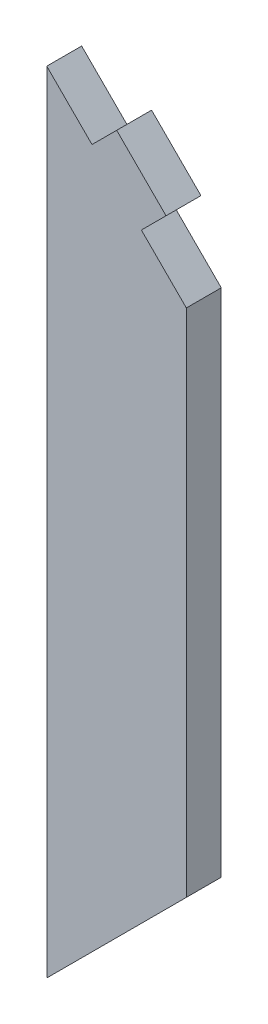
ISO-10303-21;
HEADER;
FILE_DESCRIPTION(('STEP AP214'),'2;1');
FILE_NAME('part.step','',(''),(''),'','','');
FILE_SCHEMA(('AUTOMOTIVE_DESIGN { 1 0 10303 214 1 1 1 1 }'));
ENDSEC;
DATA;
#1=APPLICATION_CONTEXT('core data for automotive mechanical design processes');
#2=APPLICATION_PROTOCOL_DEFINITION('international standard','automotive_design',2000,#1);
#3=PRODUCT_CONTEXT('',#1,'mechanical');
#4=PRODUCT('Part','Part','',(#3));
#5=PRODUCT_RELATED_PRODUCT_CATEGORY('part','',(#4));
#6=PRODUCT_DEFINITION_FORMATION('','',#4);
#7=PRODUCT_DEFINITION_CONTEXT('part definition',#1,'design');
#8=PRODUCT_DEFINITION('design','',#6,#7);
#9=PRODUCT_DEFINITION_SHAPE('','',#8);
#10=(LENGTH_UNIT() NAMED_UNIT(*) SI_UNIT(.MILLI.,.METRE.));
#11=(NAMED_UNIT(*) PLANE_ANGLE_UNIT() SI_UNIT($,.RADIAN.));
#12=(NAMED_UNIT(*) SI_UNIT($,.STERADIAN.) SOLID_ANGLE_UNIT());
#13=UNCERTAINTY_MEASURE_WITH_UNIT(LENGTH_MEASURE(1.E-05),#10,'distance_accuracy_value','');
#14=(GEOMETRIC_REPRESENTATION_CONTEXT(3) GLOBAL_UNCERTAINTY_ASSIGNED_CONTEXT((#13)) GLOBAL_UNIT_ASSIGNED_CONTEXT((#10,
#11,#12)) REPRESENTATION_CONTEXT('',''));
#15=CARTESIAN_POINT('',(0.,0.,0.));
#16=DIRECTION('',(0.,0.,1.));
#17=DIRECTION('',(1.,0.,0.));
#18=AXIS2_PLACEMENT_3D('',#15,#16,#17);
#19=CARTESIAN_POINT('',(-12.7,71.84263,6.35));
#20=DIRECTION('',(-0.707106781186549,-0.707106781186546,0.));
#21=DIRECTION('',(0.707106781186546,-0.707106781186549,0.));
#22=AXIS2_PLACEMENT_3D('',#19,#20,#21);
#23=PLANE('',#22);
#24=DIRECTION('',(0.,0.,-1.));
#25=VECTOR('',#24,1.);
#26=CARTESIAN_POINT('',(4.51539457125758,54.6272354287424,6.35));
#27=LINE('',#26,#25);
#28=CARTESIAN_POINT('',(4.51539457125757,54.6272354287424,6.35));
#29=VERTEX_POINT('',#28);
#30=CARTESIAN_POINT('',(4.51539457125757,54.6272354287424,0.));
#31=VERTEX_POINT('',#30);
#32=EDGE_CURVE('E62',#29,#31,#27,.T.);
#33=ORIENTED_EDGE('',*,*,#32,.F.);
#34=DIRECTION('',(-0.707106781186546,0.707106781186549,0.));
#35=VECTOR('',#34,1.);
#36=CARTESIAN_POINT('',(-12.7,71.84263,6.35));
#37=LINE('',#36,#35);
#38=CARTESIAN_POINT('',(12.7,46.4426299999999,6.35));
#39=VERTEX_POINT('',#38);
#40=EDGE_CURVE('E130',#39,#29,#37,.T.);
#41=ORIENTED_EDGE('',*,*,#40,.F.);
#42=DIRECTION('',(0.,0.,-1.));
#43=VECTOR('',#42,1.);
#44=CARTESIAN_POINT('',(12.7,46.4426299999999,6.35));
#45=LINE('',#44,#43);
#46=CARTESIAN_POINT('',(12.7,46.4426299999999,0.));
#47=VERTEX_POINT('',#46);
#48=EDGE_CURVE('E152',#39,#47,#45,.T.);
#49=ORIENTED_EDGE('',*,*,#48,.T.);
#50=DIRECTION('',(-0.707106781186546,0.707106781186549,0.));
#51=VECTOR('',#50,1.);
#52=CARTESIAN_POINT('',(-12.7,71.84263,0.));
#53=LINE('',#52,#51);
#54=EDGE_CURVE('E136',#47,#31,#53,.T.);
#55=ORIENTED_EDGE('',*,*,#54,.T.);
#56=EDGE_LOOP('',(#33,#41,#49,#55));
#57=FACE_BOUND('',#56,.T.);
#58=ADVANCED_FACE('F39',(#57),#23,.F.);
#59=DIRECTION('',(0.,0.,1.));
#60=VECTOR('',#59,1.);
#61=CARTESIAN_POINT('',(-4.46486154981155,63.6074915498115,6.35));
#62=LINE('',#61,#60);
#63=CARTESIAN_POINT('',(-4.46486154981155,63.6074915498115,0.));
#64=VERTEX_POINT('',#63);
#65=CARTESIAN_POINT('',(-4.46486154981156,63.6074915498115,6.35));
#66=VERTEX_POINT('',#65);
#67=EDGE_CURVE('E127',#64,#66,#62,.T.);
#68=ORIENTED_EDGE('',*,*,#67,.F.);
#69=CARTESIAN_POINT('',(-12.7,71.84263,0.));
#70=VERTEX_POINT('',#69);
#71=EDGE_CURVE('E132',#64,#70,#53,.T.);
#72=ORIENTED_EDGE('',*,*,#71,.T.);
#73=DIRECTION('',(0.,0.,-1.));
#74=VECTOR('',#73,1.);
#75=CARTESIAN_POINT('',(-12.7,71.84263,6.35));
#76=LINE('',#75,#74);
#77=CARTESIAN_POINT('',(-12.7,71.84263,6.35));
#78=VERTEX_POINT('',#77);
#79=EDGE_CURVE('E11',#78,#70,#76,.T.);
#80=ORIENTED_EDGE('',*,*,#79,.F.);
#81=EDGE_CURVE('E54',#66,#78,#37,.T.);
#82=ORIENTED_EDGE('',*,*,#81,.F.);
#83=EDGE_LOOP('',(#68,#72,#80,#82));
#84=FACE_BOUND('',#83,.T.);
#85=ADVANCED_FACE('F207',(#84),#23,.F.);
#86=CARTESIAN_POINT('',(-12.7,71.84263,6.35));
#87=DIRECTION('',(1.,0.,0.));
#88=DIRECTION('',(0.,1.,0.));
#89=AXIS2_PLACEMENT_3D('',#86,#87,#88);
#90=PLANE('',#89);
#91=DIRECTION('',(0.,-1.,0.));
#92=VECTOR('',#91,1.);
#93=CARTESIAN_POINT('',(-12.7,71.84263,0.));
#94=LINE('',#93,#92);
#95=CARTESIAN_POINT('',(-12.7,-71.84263,0.));
#96=VERTEX_POINT('',#95);
#97=EDGE_CURVE('E155',#70,#96,#94,.T.);
#98=ORIENTED_EDGE('',*,*,#97,.T.);
#99=DIRECTION('',(0.,0.,-1.));
#100=VECTOR('',#99,1.);
#101=CARTESIAN_POINT('',(-12.7,-71.84263,6.35));
#102=LINE('',#101,#100);
#103=CARTESIAN_POINT('',(-12.7,-71.84263,6.35));
#104=VERTEX_POINT('',#103);
#105=EDGE_CURVE('E47',#104,#96,#102,.T.);
#106=ORIENTED_EDGE('',*,*,#105,.F.);
#107=DIRECTION('',(0.,-1.,0.));
#108=VECTOR('',#107,1.);
#109=CARTESIAN_POINT('',(-12.7,71.84263,6.35));
#110=LINE('',#109,#108);
#111=EDGE_CURVE('E144',#78,#104,#110,.T.);
#112=ORIENTED_EDGE('',*,*,#111,.F.);
#113=ORIENTED_EDGE('',*,*,#79,.T.);
#114=EDGE_LOOP('',(#98,#106,#112,#113));
#115=FACE_BOUND('',#114,.T.);
#116=ADVANCED_FACE('F206',(#115),#90,.F.);
#117=CARTESIAN_POINT('',(-12.7,-71.84263,6.35));
#118=DIRECTION('',(-0.707106781186552,0.707106781186543,0.));
#119=DIRECTION('',(-0.707106781186543,-0.707106781186552,0.));
#120=AXIS2_PLACEMENT_3D('',#117,#118,#119);
#121=PLANE('',#120);
#122=DIRECTION('',(0.707106781186544,0.707106781186552,0.));
#123=VECTOR('',#122,1.);
#124=CARTESIAN_POINT('',(-12.7,-71.84263,0.));
#125=LINE('',#124,#123);
#126=CARTESIAN_POINT('',(12.7,-46.4426299999997,0.));
#127=VERTEX_POINT('',#126);
#128=EDGE_CURVE('E158',#96,#127,#125,.T.);
#129=ORIENTED_EDGE('',*,*,#128,.T.);
#130=DIRECTION('',(0.,0.,-1.));
#131=VECTOR('',#130,1.);
#132=CARTESIAN_POINT('',(12.7,-46.4426299999997,6.35));
#133=LINE('',#132,#131);
#134=CARTESIAN_POINT('',(12.7,-46.4426299999997,6.35));
#135=VERTEX_POINT('',#134);
#136=EDGE_CURVE('E167',#135,#127,#133,.T.);
#137=ORIENTED_EDGE('',*,*,#136,.F.);
#138=DIRECTION('',(0.707106781186544,0.707106781186552,0.));
#139=VECTOR('',#138,1.);
#140=CARTESIAN_POINT('',(-12.7,-71.84263,6.35));
#141=LINE('',#140,#139);
#142=EDGE_CURVE('E147',#104,#135,#141,.T.);
#143=ORIENTED_EDGE('',*,*,#142,.F.);
#144=ORIENTED_EDGE('',*,*,#105,.T.);
#145=EDGE_LOOP('',(#129,#137,#143,#144));
#146=FACE_BOUND('',#145,.T.);
#147=ADVANCED_FACE('F176',(#146),#121,.F.);
#148=CARTESIAN_POINT('',(12.7,46.4426299999999,6.35));
#149=DIRECTION('',(-1.,0.,0.));
#150=DIRECTION('',(0.,-1.,0.));
#151=AXIS2_PLACEMENT_3D('',#148,#149,#150);
#152=PLANE('',#151);
#153=DIRECTION('',(0.,1.,0.));
#154=VECTOR('',#153,1.);
#155=CARTESIAN_POINT('',(12.7,46.4426299999999,0.));
#156=LINE('',#155,#154);
#157=EDGE_CURVE('E161',#127,#47,#156,.T.);
#158=ORIENTED_EDGE('',*,*,#157,.T.);
#159=ORIENTED_EDGE('',*,*,#48,.F.);
#160=DIRECTION('',(0.,1.,0.));
#161=VECTOR('',#160,1.);
#162=CARTESIAN_POINT('',(12.7,46.4426299999999,6.35));
#163=LINE('',#162,#161);
#164=EDGE_CURVE('E150',#135,#39,#163,.T.);
#165=ORIENTED_EDGE('',*,*,#164,.F.);
#166=ORIENTED_EDGE('',*,*,#136,.T.);
#167=EDGE_LOOP('',(#158,#159,#165,#166));
#168=FACE_BOUND('',#167,.T.);
#169=ADVANCED_FACE('F187',(#168),#152,.F.);
#170=CARTESIAN_POINT('',(0.,0.,6.35));
#171=DIRECTION('',(0.,0.,1.));
#172=DIRECTION('',(1.,0.,0.));
#173=AXIS2_PLACEMENT_3D('',#170,#171,#172);
#174=PLANE('',#173);
#175=ORIENTED_EDGE('',*,*,#40,.T.);
#176=DIRECTION('',(-0.707106781186549,-0.707106781186546,0.));
#177=VECTOR('',#176,1.);
#178=CARTESIAN_POINT('',(9.00552263179217,59.1173634892769,6.35));
#179=LINE('',#178,#177);
#180=CARTESIAN_POINT('',(9.00552263179217,59.1173634892769,6.35));
#181=VERTEX_POINT('',#180);
#182=EDGE_CURVE('E110',#181,#29,#179,.T.);
#183=ORIENTED_EDGE('',*,*,#182,.F.);
#184=DIRECTION('',(0.707106781186546,-0.707106781186549,0.));
#185=VECTOR('',#184,1.);
#186=CARTESIAN_POINT('',(0.0252665107230319,68.0976196103461,6.35));
#187=LINE('',#186,#185);
#188=CARTESIAN_POINT('',(0.0252665107230319,68.0976196103461,6.35));
#189=VERTEX_POINT('',#188);
#190=EDGE_CURVE('E117',#189,#181,#187,.T.);
#191=ORIENTED_EDGE('',*,*,#190,.F.);
#192=DIRECTION('',(-0.707106781186549,-0.707106781186546,0.));
#193=VECTOR('',#192,1.);
#194=CARTESIAN_POINT('',(0.0252665107230319,68.0976196103461,6.35));
#195=LINE('',#194,#193);
#196=EDGE_CURVE('E196',#189,#66,#195,.T.);
#197=ORIENTED_EDGE('',*,*,#196,.T.);
#198=ORIENTED_EDGE('',*,*,#81,.T.);
#199=ORIENTED_EDGE('',*,*,#111,.T.);
#200=ORIENTED_EDGE('',*,*,#142,.T.);
#201=ORIENTED_EDGE('',*,*,#164,.T.);
#202=EDGE_LOOP('',(#175,#183,#191,#197,#198,#199,#200,#201));
#203=FACE_BOUND('',#202,.T.);
#204=ADVANCED_FACE('F129',(#203),#174,.T.);
#205=CARTESIAN_POINT('',(0.,0.,0.));
#206=DIRECTION('',(0.,0.,1.));
#207=DIRECTION('',(1.,0.,0.));
#208=AXIS2_PLACEMENT_3D('',#205,#206,#207);
#209=PLANE('',#208);
#210=ORIENTED_EDGE('',*,*,#54,.F.);
#211=ORIENTED_EDGE('',*,*,#157,.F.);
#212=ORIENTED_EDGE('',*,*,#128,.F.);
#213=ORIENTED_EDGE('',*,*,#97,.F.);
#214=ORIENTED_EDGE('',*,*,#71,.F.);
#215=DIRECTION('',(-0.707106781186549,-0.707106781186546,0.));
#216=VECTOR('',#215,1.);
#217=CARTESIAN_POINT('',(0.0252665107230319,68.0976196103461,0.));
#218=LINE('',#217,#216);
#219=CARTESIAN_POINT('',(0.0252665107230319,68.0976196103461,0.));
#220=VERTEX_POINT('',#219);
#221=EDGE_CURVE('E138',#220,#64,#218,.T.);
#222=ORIENTED_EDGE('',*,*,#221,.F.);
#223=DIRECTION('',(-0.707106781186546,0.707106781186549,0.));
#224=VECTOR('',#223,1.);
#225=CARTESIAN_POINT('',(0.0252665107230319,68.0976196103461,0.));
#226=LINE('',#225,#224);
#227=CARTESIAN_POINT('',(9.00552263179217,59.1173634892769,0.));
#228=VERTEX_POINT('',#227);
#229=EDGE_CURVE('E116',#228,#220,#226,.T.);
#230=ORIENTED_EDGE('',*,*,#229,.F.);
#231=DIRECTION('',(-0.707106781186549,-0.707106781186546,0.));
#232=VECTOR('',#231,1.);
#233=CARTESIAN_POINT('',(9.00552263179217,59.1173634892769,0.));
#234=LINE('',#233,#232);
#235=EDGE_CURVE('E112',#228,#31,#234,.T.);
#236=ORIENTED_EDGE('',*,*,#235,.T.);
#237=EDGE_LOOP('',(#210,#211,#212,#213,#214,#222,#230,#236));
#238=FACE_BOUND('',#237,.T.);
#239=ADVANCED_FACE('F184',(#238),#209,.F.);
#240=CARTESIAN_POINT('',(9.00552263179217,59.1173634892769,6.35));
#241=DIRECTION('',(-0.707106781186546,0.707106781186549,0.));
#242=DIRECTION('',(-0.707106781186549,-0.707106781186546,0.));
#243=AXIS2_PLACEMENT_3D('',#240,#241,#242);
#244=PLANE('',#243);
#245=ORIENTED_EDGE('',*,*,#32,.T.);
#246=ORIENTED_EDGE('',*,*,#235,.F.);
#247=DIRECTION('',(0.,0.,-1.));
#248=VECTOR('',#247,1.);
#249=CARTESIAN_POINT('',(9.00552263179217,59.1173634892769,6.35));
#250=LINE('',#249,#248);
#251=EDGE_CURVE('E106',#181,#228,#250,.T.);
#252=ORIENTED_EDGE('',*,*,#251,.F.);
#253=ORIENTED_EDGE('',*,*,#182,.T.);
#254=EDGE_LOOP('',(#245,#246,#252,#253));
#255=FACE_BOUND('',#254,.T.);
#256=ADVANCED_FACE('F108',(#255),#244,.F.);
#257=CARTESIAN_POINT('',(0.0252665107230319,68.0976196103461,6.35));
#258=DIRECTION('',(0.707106781186546,-0.707106781186549,0.));
#259=DIRECTION('',(0.707106781186549,0.707106781186546,0.));
#260=AXIS2_PLACEMENT_3D('',#257,#258,#259);
#261=PLANE('',#260);
#262=ORIENTED_EDGE('',*,*,#67,.T.);
#263=ORIENTED_EDGE('',*,*,#196,.F.);
#264=DIRECTION('',(0.,0.,1.));
#265=VECTOR('',#264,1.);
#266=CARTESIAN_POINT('',(0.0252665107230319,68.0976196103461,6.35));
#267=LINE('',#266,#265);
#268=EDGE_CURVE('E122',#220,#189,#267,.T.);
#269=ORIENTED_EDGE('',*,*,#268,.F.);
#270=ORIENTED_EDGE('',*,*,#221,.T.);
#271=EDGE_LOOP('',(#262,#263,#269,#270));
#272=FACE_BOUND('',#271,.T.);
#273=ADVANCED_FACE('F204',(#272),#261,.F.);
#274=CARTESIAN_POINT('',(34.0614430605346,34.0614430605344,0.));
#275=DIRECTION('',(0.707106781186549,0.707106781186546,0.));
#276=DIRECTION('',(-0.707106781186546,0.707106781186549,0.));
#277=AXIS2_PLACEMENT_3D('',#274,#275,#276);
#278=PLANE('',#277);
#279=ORIENTED_EDGE('',*,*,#190,.T.);
#280=ORIENTED_EDGE('',*,*,#251,.T.);
#281=ORIENTED_EDGE('',*,*,#229,.T.);
#282=ORIENTED_EDGE('',*,*,#268,.T.);
#283=EDGE_LOOP('',(#279,#280,#281,#282));
#284=FACE_BOUND('',#283,.T.);
#285=ADVANCED_FACE('F120',(#284),#278,.T.);
#286=CLOSED_SHELL('',(#58,#85,#116,#147,#169,#204,#239,#256,#273,#285));
#287=MANIFOLD_SOLID_BREP('B2',#286);
#288=ADVANCED_BREP_SHAPE_REPRESENTATION('',(#18,#287),#14);
#289=SHAPE_DEFINITION_REPRESENTATION(#9,#288);
ENDSEC;
END-ISO-10303-21;
